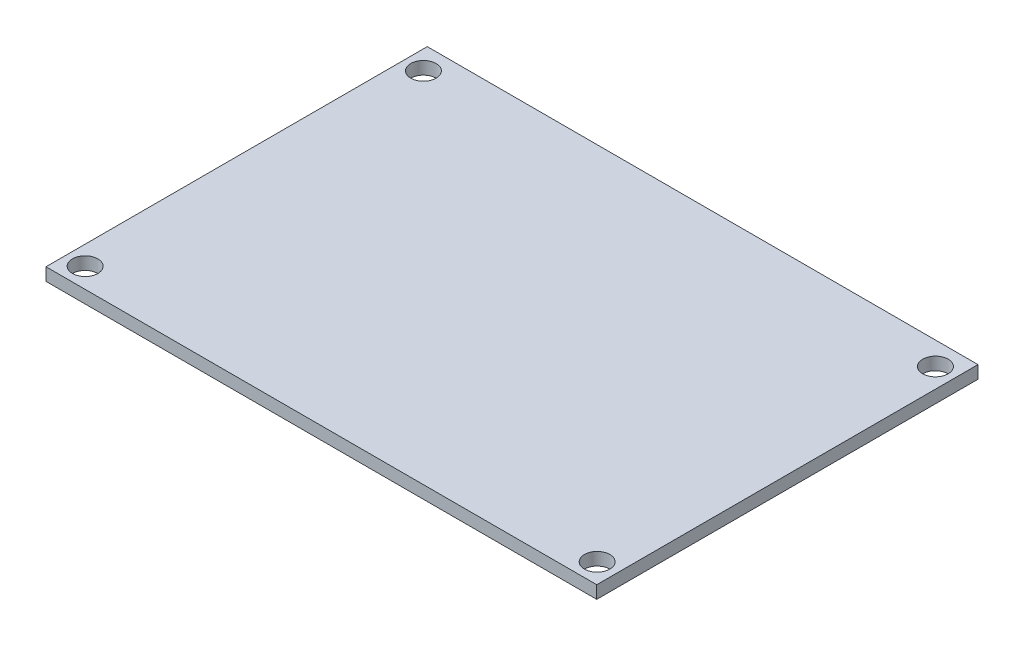
ISO-10303-21;
HEADER;
FILE_DESCRIPTION(('STEP AP214'),'2;1');
FILE_NAME('part.step','',(''),(''),'','','');
FILE_SCHEMA(('AUTOMOTIVE_DESIGN { 1 0 10303 214 1 1 1 1 }'));
ENDSEC;
DATA;
#1=APPLICATION_CONTEXT('core data for automotive mechanical design processes');
#2=APPLICATION_PROTOCOL_DEFINITION('international standard','automotive_design',2000,#1);
#3=PRODUCT_CONTEXT('',#1,'mechanical');
#4=PRODUCT('Part','Part','',(#3));
#5=PRODUCT_RELATED_PRODUCT_CATEGORY('part','',(#4));
#6=PRODUCT_DEFINITION_FORMATION('','',#4);
#7=PRODUCT_DEFINITION_CONTEXT('part definition',#1,'design');
#8=PRODUCT_DEFINITION('design','',#6,#7);
#9=PRODUCT_DEFINITION_SHAPE('','',#8);
#10=(LENGTH_UNIT() NAMED_UNIT(*) SI_UNIT(.MILLI.,.METRE.));
#11=(NAMED_UNIT(*) PLANE_ANGLE_UNIT() SI_UNIT($,.RADIAN.));
#12=(NAMED_UNIT(*) SI_UNIT($,.STERADIAN.) SOLID_ANGLE_UNIT());
#13=UNCERTAINTY_MEASURE_WITH_UNIT(LENGTH_MEASURE(1.E-05),#10,'distance_accuracy_value','');
#14=(GEOMETRIC_REPRESENTATION_CONTEXT(3) GLOBAL_UNCERTAINTY_ASSIGNED_CONTEXT((#13)) GLOBAL_UNIT_ASSIGNED_CONTEXT((#10,
#11,#12)) REPRESENTATION_CONTEXT('',''));
#15=CARTESIAN_POINT('',(0.,0.,0.));
#16=DIRECTION('',(0.,0.,1.));
#17=DIRECTION('',(1.,0.,0.));
#18=AXIS2_PLACEMENT_3D('',#15,#16,#17);
#19=CARTESIAN_POINT('',(32.5,1.5,-22.5));
#20=DIRECTION('',(-1.,0.,0.));
#21=DIRECTION('',(0.,0.,1.));
#22=AXIS2_PLACEMENT_3D('',#19,#20,#21);
#23=PLANE('',#22);
#24=DIRECTION('',(0.,0.,-1.));
#25=VECTOR('',#24,1.);
#26=CARTESIAN_POINT('',(32.5,0.,-22.5));
#27=LINE('',#26,#25);
#28=CARTESIAN_POINT('',(32.5,0.,22.5));
#29=VERTEX_POINT('',#28);
#30=CARTESIAN_POINT('',(32.5,0.,-22.5));
#31=VERTEX_POINT('',#30);
#32=EDGE_CURVE('E98',#29,#31,#27,.T.);
#33=ORIENTED_EDGE('',*,*,#32,.T.);
#34=DIRECTION('',(0.,-1.,0.));
#35=VECTOR('',#34,1.);
#36=CARTESIAN_POINT('',(32.5,1.5,-22.5));
#37=LINE('',#36,#35);
#38=CARTESIAN_POINT('',(32.5,1.5,-22.5));
#39=VERTEX_POINT('',#38);
#40=EDGE_CURVE('E11',#39,#31,#37,.T.);
#41=ORIENTED_EDGE('',*,*,#40,.F.);
#42=DIRECTION('',(0.,0.,-1.));
#43=VECTOR('',#42,1.);
#44=CARTESIAN_POINT('',(32.5,1.5,-22.5));
#45=LINE('',#44,#43);
#46=CARTESIAN_POINT('',(32.5,1.5,22.5));
#47=VERTEX_POINT('',#46);
#48=EDGE_CURVE('E86',#47,#39,#45,.T.);
#49=ORIENTED_EDGE('',*,*,#48,.F.);
#50=DIRECTION('',(0.,-1.,0.));
#51=VECTOR('',#50,1.);
#52=CARTESIAN_POINT('',(32.5,1.5,22.5));
#53=LINE('',#52,#51);
#54=EDGE_CURVE('E94',#47,#29,#53,.T.);
#55=ORIENTED_EDGE('',*,*,#54,.T.);
#56=EDGE_LOOP('',(#33,#41,#49,#55));
#57=FACE_BOUND('',#56,.T.);
#58=ADVANCED_FACE('F35',(#57),#23,.F.);
#59=CARTESIAN_POINT('',(-32.5,1.5,-22.5));
#60=DIRECTION('',(0.,0.,1.));
#61=DIRECTION('',(1.,0.,0.));
#62=AXIS2_PLACEMENT_3D('',#59,#60,#61);
#63=PLANE('',#62);
#64=DIRECTION('',(-1.,0.,0.));
#65=VECTOR('',#64,1.);
#66=CARTESIAN_POINT('',(-32.5,0.,-22.5));
#67=LINE('',#66,#65);
#68=CARTESIAN_POINT('',(-32.5,0.,-22.5));
#69=VERTEX_POINT('',#68);
#70=EDGE_CURVE('E90',#31,#69,#67,.T.);
#71=ORIENTED_EDGE('',*,*,#70,.T.);
#72=DIRECTION('',(0.,-1.,0.));
#73=VECTOR('',#72,1.);
#74=CARTESIAN_POINT('',(-32.5,1.5,-22.5));
#75=LINE('',#74,#73);
#76=CARTESIAN_POINT('',(-32.5,1.5,-22.5));
#77=VERTEX_POINT('',#76);
#78=EDGE_CURVE('E43',#77,#69,#75,.T.);
#79=ORIENTED_EDGE('',*,*,#78,.F.);
#80=DIRECTION('',(-1.,0.,0.));
#81=VECTOR('',#80,1.);
#82=CARTESIAN_POINT('',(-32.5,1.5,-22.5));
#83=LINE('',#82,#81);
#84=EDGE_CURVE('E81',#39,#77,#83,.T.);
#85=ORIENTED_EDGE('',*,*,#84,.F.);
#86=ORIENTED_EDGE('',*,*,#40,.T.);
#87=EDGE_LOOP('',(#71,#79,#85,#86));
#88=FACE_BOUND('',#87,.T.);
#89=ADVANCED_FACE('F89',(#88),#63,.F.);
#90=CARTESIAN_POINT('',(-32.5,1.5,-22.5));
#91=DIRECTION('',(1.,0.,0.));
#92=DIRECTION('',(0.,0.,-1.));
#93=AXIS2_PLACEMENT_3D('',#90,#91,#92);
#94=PLANE('',#93);
#95=DIRECTION('',(0.,0.,1.));
#96=VECTOR('',#95,1.);
#97=CARTESIAN_POINT('',(-32.5,0.,-22.5));
#98=LINE('',#97,#96);
#99=CARTESIAN_POINT('',(-32.5,0.,22.5));
#100=VERTEX_POINT('',#99);
#101=EDGE_CURVE('E68',#69,#100,#98,.T.);
#102=ORIENTED_EDGE('',*,*,#101,.T.);
#103=DIRECTION('',(0.,-1.,0.));
#104=VECTOR('',#103,1.);
#105=CARTESIAN_POINT('',(-32.5,1.5,22.5));
#106=LINE('',#105,#104);
#107=CARTESIAN_POINT('',(-32.5,1.5,22.5));
#108=VERTEX_POINT('',#107);
#109=EDGE_CURVE('E91',#108,#100,#106,.T.);
#110=ORIENTED_EDGE('',*,*,#109,.F.);
#111=DIRECTION('',(0.,0.,1.));
#112=VECTOR('',#111,1.);
#113=CARTESIAN_POINT('',(-32.5,1.5,-22.5));
#114=LINE('',#113,#112);
#115=EDGE_CURVE('E84',#77,#108,#114,.T.);
#116=ORIENTED_EDGE('',*,*,#115,.F.);
#117=ORIENTED_EDGE('',*,*,#78,.T.);
#118=EDGE_LOOP('',(#102,#110,#116,#117));
#119=FACE_BOUND('',#118,.T.);
#120=ADVANCED_FACE('F92',(#119),#94,.F.);
#121=CARTESIAN_POINT('',(-32.5,1.5,22.5));
#122=DIRECTION('',(0.,0.,-1.));
#123=DIRECTION('',(-1.,0.,0.));
#124=AXIS2_PLACEMENT_3D('',#121,#122,#123);
#125=PLANE('',#124);
#126=DIRECTION('',(1.,0.,0.));
#127=VECTOR('',#126,1.);
#128=CARTESIAN_POINT('',(-32.5,0.,22.5));
#129=LINE('',#128,#127);
#130=EDGE_CURVE('E74',#100,#29,#129,.T.);
#131=ORIENTED_EDGE('',*,*,#130,.T.);
#132=ORIENTED_EDGE('',*,*,#54,.F.);
#133=DIRECTION('',(1.,0.,0.));
#134=VECTOR('',#133,1.);
#135=CARTESIAN_POINT('',(-32.5,1.5,22.5));
#136=LINE('',#135,#134);
#137=EDGE_CURVE('E51',#108,#47,#136,.T.);
#138=ORIENTED_EDGE('',*,*,#137,.F.);
#139=ORIENTED_EDGE('',*,*,#109,.T.);
#140=EDGE_LOOP('',(#131,#132,#138,#139));
#141=FACE_BOUND('',#140,.T.);
#142=ADVANCED_FACE('F106',(#141),#125,.F.);
#143=CARTESIAN_POINT('',(0.,1.5,0.));
#144=DIRECTION('',(0.,1.,0.));
#145=DIRECTION('',(0.,0.,1.));
#146=AXIS2_PLACEMENT_3D('',#143,#144,#145);
#147=PLANE('',#146);
#148=CARTESIAN_POINT('',(-30.2498149437522,1.5,20.1327068137948));
#149=DIRECTION('',(0.,1.,0.));
#150=DIRECTION('',(0.,0.,1.));
#151=AXIS2_PLACEMENT_3D('',#148,#149,#150);
#152=CIRCLE('',#151,1.5);
#153=CARTESIAN_POINT('',(-30.2498149437522,1.5,21.6327068137948));
#154=VERTEX_POINT('',#153);
#155=EDGE_CURVE('E130',#154,#154,#152,.T.);
#156=ORIENTED_EDGE('',*,*,#155,.F.);
#157=EDGE_LOOP('',(#156));
#158=FACE_BOUND('',#157,.T.);
#159=CARTESIAN_POINT('',(30.1821419796722,1.5,20.1327068137948));
#160=DIRECTION('',(0.,1.,0.));
#161=DIRECTION('',(0.,0.,1.));
#162=AXIS2_PLACEMENT_3D('',#159,#160,#161);
#163=CIRCLE('',#162,1.5);
#164=CARTESIAN_POINT('',(30.1821419796722,1.5,21.6327068137948));
#165=VERTEX_POINT('',#164);
#166=EDGE_CURVE('E124',#165,#165,#163,.T.);
#167=ORIENTED_EDGE('',*,*,#166,.F.);
#168=EDGE_LOOP('',(#167));
#169=FACE_BOUND('',#168,.T.);
#170=CARTESIAN_POINT('',(30.1821419796722,1.5,-19.7943419933949));
#171=DIRECTION('',(0.,1.,0.));
#172=DIRECTION('',(0.,0.,1.));
#173=AXIS2_PLACEMENT_3D('',#170,#171,#172);
#174=CIRCLE('',#173,1.5);
#175=CARTESIAN_POINT('',(30.1821419796722,1.5,-18.2943419933949));
#176=VERTEX_POINT('',#175);
#177=EDGE_CURVE('E118',#176,#176,#174,.T.);
#178=ORIENTED_EDGE('',*,*,#177,.F.);
#179=EDGE_LOOP('',(#178));
#180=FACE_BOUND('',#179,.T.);
#181=CARTESIAN_POINT('',(-30.2498149437522,1.5,-19.7943419933949));
#182=DIRECTION('',(0.,1.,0.));
#183=DIRECTION('',(0.,0.,1.));
#184=AXIS2_PLACEMENT_3D('',#181,#182,#183);
#185=CIRCLE('',#184,1.5);
#186=CARTESIAN_POINT('',(-30.2498149437522,1.5,-18.2943419933949));
#187=VERTEX_POINT('',#186);
#188=EDGE_CURVE('E112',#187,#187,#185,.T.);
#189=ORIENTED_EDGE('',*,*,#188,.F.);
#190=EDGE_LOOP('',(#189));
#191=FACE_BOUND('',#190,.T.);
#192=ORIENTED_EDGE('',*,*,#48,.T.);
#193=ORIENTED_EDGE('',*,*,#84,.T.);
#194=ORIENTED_EDGE('',*,*,#115,.T.);
#195=ORIENTED_EDGE('',*,*,#137,.T.);
#196=EDGE_LOOP('',(#192,#193,#194,#195));
#197=FACE_BOUND('',#196,.T.);
#198=ADVANCED_FACE('F82',(#158,#169,#180,#191,#197),#147,.T.);
#199=CARTESIAN_POINT('',(0.,0.,0.));
#200=DIRECTION('',(0.,1.,0.));
#201=DIRECTION('',(0.,0.,1.));
#202=AXIS2_PLACEMENT_3D('',#199,#200,#201);
#203=PLANE('',#202);
#204=CARTESIAN_POINT('',(-30.2498149437522,0.,20.1327068137948));
#205=DIRECTION('',(0.,1.,0.));
#206=DIRECTION('',(0.,0.,1.));
#207=AXIS2_PLACEMENT_3D('',#204,#205,#206);
#208=CIRCLE('',#207,1.5);
#209=CARTESIAN_POINT('',(-30.2498149437522,0.,21.6327068137948));
#210=VERTEX_POINT('',#209);
#211=EDGE_CURVE('E127',#210,#210,#208,.T.);
#212=ORIENTED_EDGE('',*,*,#211,.T.);
#213=EDGE_LOOP('',(#212));
#214=FACE_BOUND('',#213,.T.);
#215=CARTESIAN_POINT('',(30.1821419796722,0.,20.1327068137948));
#216=DIRECTION('',(0.,1.,0.));
#217=DIRECTION('',(0.,0.,1.));
#218=AXIS2_PLACEMENT_3D('',#215,#216,#217);
#219=CIRCLE('',#218,1.5);
#220=CARTESIAN_POINT('',(30.1821419796722,0.,21.6327068137948));
#221=VERTEX_POINT('',#220);
#222=EDGE_CURVE('E121',#221,#221,#219,.T.);
#223=ORIENTED_EDGE('',*,*,#222,.T.);
#224=EDGE_LOOP('',(#223));
#225=FACE_BOUND('',#224,.T.);
#226=CARTESIAN_POINT('',(30.1821419796722,0.,-19.7943419933949));
#227=DIRECTION('',(0.,1.,0.));
#228=DIRECTION('',(0.,0.,1.));
#229=AXIS2_PLACEMENT_3D('',#226,#227,#228);
#230=CIRCLE('',#229,1.5);
#231=CARTESIAN_POINT('',(30.1821419796722,0.,-18.2943419933949));
#232=VERTEX_POINT('',#231);
#233=EDGE_CURVE('E115',#232,#232,#230,.T.);
#234=ORIENTED_EDGE('',*,*,#233,.T.);
#235=EDGE_LOOP('',(#234));
#236=FACE_BOUND('',#235,.T.);
#237=CARTESIAN_POINT('',(-30.2498149437522,0.,-19.7943419933949));
#238=DIRECTION('',(0.,1.,0.));
#239=DIRECTION('',(0.,0.,1.));
#240=AXIS2_PLACEMENT_3D('',#237,#238,#239);
#241=CIRCLE('',#240,1.5);
#242=CARTESIAN_POINT('',(-30.2498149437522,0.,-18.2943419933949));
#243=VERTEX_POINT('',#242);
#244=EDGE_CURVE('E101',#243,#243,#241,.T.);
#245=ORIENTED_EDGE('',*,*,#244,.T.);
#246=EDGE_LOOP('',(#245));
#247=FACE_BOUND('',#246,.T.);
#248=ORIENTED_EDGE('',*,*,#32,.F.);
#249=ORIENTED_EDGE('',*,*,#130,.F.);
#250=ORIENTED_EDGE('',*,*,#101,.F.);
#251=ORIENTED_EDGE('',*,*,#70,.F.);
#252=EDGE_LOOP('',(#248,#249,#250,#251));
#253=FACE_BOUND('',#252,.T.);
#254=ADVANCED_FACE('F109',(#214,#225,#236,#247,#253),#203,.F.);
#255=CARTESIAN_POINT('',(-30.2498149437522,0.,-19.7943419933949));
#256=DIRECTION('',(0.,1.,0.));
#257=DIRECTION('',(0.,0.,1.));
#258=AXIS2_PLACEMENT_3D('',#255,#256,#257);
#259=CYLINDRICAL_SURFACE('',#258,1.5);
#260=ORIENTED_EDGE('',*,*,#244,.F.);
#261=EDGE_LOOP('',(#260));
#262=FACE_BOUND('',#261,.T.);
#263=ORIENTED_EDGE('',*,*,#188,.T.);
#264=EDGE_LOOP('',(#263));
#265=FACE_BOUND('',#264,.T.);
#266=ADVANCED_FACE('F154',(#262,#265),#259,.F.);
#267=CARTESIAN_POINT('',(30.1821419796722,0.,-19.7943419933949));
#268=DIRECTION('',(0.,1.,0.));
#269=DIRECTION('',(0.,0.,1.));
#270=AXIS2_PLACEMENT_3D('',#267,#268,#269);
#271=CYLINDRICAL_SURFACE('',#270,1.5);
#272=ORIENTED_EDGE('',*,*,#233,.F.);
#273=EDGE_LOOP('',(#272));
#274=FACE_BOUND('',#273,.T.);
#275=ORIENTED_EDGE('',*,*,#177,.T.);
#276=EDGE_LOOP('',(#275));
#277=FACE_BOUND('',#276,.T.);
#278=ADVANCED_FACE('F156',(#274,#277),#271,.F.);
#279=CARTESIAN_POINT('',(30.1821419796722,0.,20.1327068137948));
#280=DIRECTION('',(0.,1.,0.));
#281=DIRECTION('',(0.,0.,1.));
#282=AXIS2_PLACEMENT_3D('',#279,#280,#281);
#283=CYLINDRICAL_SURFACE('',#282,1.5);
#284=ORIENTED_EDGE('',*,*,#222,.F.);
#285=EDGE_LOOP('',(#284));
#286=FACE_BOUND('',#285,.T.);
#287=ORIENTED_EDGE('',*,*,#166,.T.);
#288=EDGE_LOOP('',(#287));
#289=FACE_BOUND('',#288,.T.);
#290=ADVANCED_FACE('F141',(#286,#289),#283,.F.);
#291=CARTESIAN_POINT('',(-30.2498149437522,0.,20.1327068137948));
#292=DIRECTION('',(0.,1.,0.));
#293=DIRECTION('',(0.,0.,1.));
#294=AXIS2_PLACEMENT_3D('',#291,#292,#293);
#295=CYLINDRICAL_SURFACE('',#294,1.5);
#296=ORIENTED_EDGE('',*,*,#211,.F.);
#297=EDGE_LOOP('',(#296));
#298=FACE_BOUND('',#297,.T.);
#299=ORIENTED_EDGE('',*,*,#155,.T.);
#300=EDGE_LOOP('',(#299));
#301=FACE_BOUND('',#300,.T.);
#302=ADVANCED_FACE('F138',(#298,#301),#295,.F.);
#303=CLOSED_SHELL('',(#58,#89,#120,#142,#198,#254,#266,#278,#290,#302));
#304=MANIFOLD_SOLID_BREP('B2',#303);
#305=ADVANCED_BREP_SHAPE_REPRESENTATION('',(#18,#304),#14);
#306=SHAPE_DEFINITION_REPRESENTATION(#9,#305);
ENDSEC;
END-ISO-10303-21;
